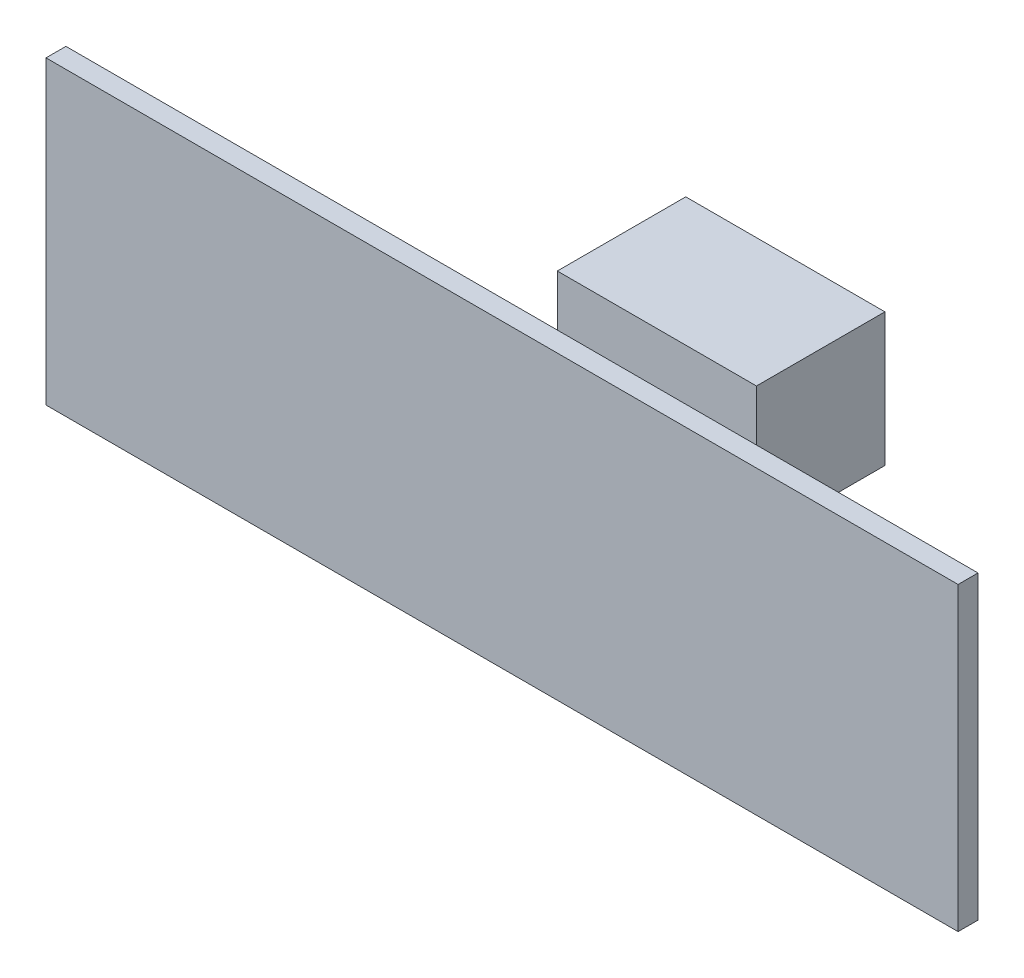
ISO-10303-21;
HEADER;
FILE_DESCRIPTION(('STEP AP214'),'2;1');
FILE_NAME('part.step','',(''),(''),'','','');
FILE_SCHEMA(('AUTOMOTIVE_DESIGN { 1 0 10303 214 1 1 1 1 }'));
ENDSEC;
DATA;
#1=APPLICATION_CONTEXT('core data for automotive mechanical design processes');
#2=APPLICATION_PROTOCOL_DEFINITION('international standard','automotive_design',2000,#1);
#3=PRODUCT_CONTEXT('',#1,'mechanical');
#4=PRODUCT('Part','Part','',(#3));
#5=PRODUCT_RELATED_PRODUCT_CATEGORY('part','',(#4));
#6=PRODUCT_DEFINITION_FORMATION('','',#4);
#7=PRODUCT_DEFINITION_CONTEXT('part definition',#1,'design');
#8=PRODUCT_DEFINITION('design','',#6,#7);
#9=PRODUCT_DEFINITION_SHAPE('','',#8);
#10=(LENGTH_UNIT() NAMED_UNIT(*) SI_UNIT(.MILLI.,.METRE.));
#11=(NAMED_UNIT(*) PLANE_ANGLE_UNIT() SI_UNIT($,.RADIAN.));
#12=(NAMED_UNIT(*) SI_UNIT($,.STERADIAN.) SOLID_ANGLE_UNIT());
#13=UNCERTAINTY_MEASURE_WITH_UNIT(LENGTH_MEASURE(1.E-05),#10,'distance_accuracy_value','');
#14=(GEOMETRIC_REPRESENTATION_CONTEXT(3) GLOBAL_UNCERTAINTY_ASSIGNED_CONTEXT((#13)) GLOBAL_UNIT_ASSIGNED_CONTEXT((#10,
#11,#12)) REPRESENTATION_CONTEXT('',''));
#15=CARTESIAN_POINT('',(0.,0.,0.));
#16=DIRECTION('',(0.,0.,1.));
#17=DIRECTION('',(1.,0.,0.));
#18=AXIS2_PLACEMENT_3D('',#15,#16,#17);
#19=CARTESIAN_POINT('',(12.7,-8.49001154742446,-8.1909510539635));
#20=DIRECTION('',(0.,0.,1.));
#21=DIRECTION('',(1.,0.,0.));
#22=AXIS2_PLACEMENT_3D('',#19,#20,#21);
#23=PLANE('',#22);
#24=DIRECTION('',(0.,1.,0.));
#25=VECTOR('',#24,1.);
#26=CARTESIAN_POINT('',(-12.7,-8.49001154742446,-8.1909510539635));
#27=LINE('',#26,#25);
#28=CARTESIAN_POINT('',(-12.7,-8.49001154742446,-8.1909510539635));
#29=VERTEX_POINT('',#28);
#30=CARTESIAN_POINT('',(-12.7,8.49001154742446,-8.1909510539635));
#31=VERTEX_POINT('',#30);
#32=EDGE_CURVE('E106',#29,#31,#27,.T.);
#33=ORIENTED_EDGE('',*,*,#32,.T.);
#34=DIRECTION('',(-1.,0.,0.));
#35=VECTOR('',#34,1.);
#36=CARTESIAN_POINT('',(12.7,8.49001154742446,-8.1909510539635));
#37=LINE('',#36,#35);
#38=CARTESIAN_POINT('',(12.7,8.49001154742446,-8.1909510539635));
#39=VERTEX_POINT('',#38);
#40=EDGE_CURVE('E12',#39,#31,#37,.T.);
#41=ORIENTED_EDGE('',*,*,#40,.F.);
#42=DIRECTION('',(0.,1.,0.));
#43=VECTOR('',#42,1.);
#44=CARTESIAN_POINT('',(12.7,-8.49001154742446,-8.1909510539635));
#45=LINE('',#44,#43);
#46=CARTESIAN_POINT('',(12.7,-8.49001154742446,-8.1909510539635));
#47=VERTEX_POINT('',#46);
#48=EDGE_CURVE('E94',#47,#39,#45,.T.);
#49=ORIENTED_EDGE('',*,*,#48,.F.);
#50=DIRECTION('',(-1.,0.,0.));
#51=VECTOR('',#50,1.);
#52=CARTESIAN_POINT('',(12.7,-8.49001154742446,-8.1909510539635));
#53=LINE('',#52,#51);
#54=EDGE_CURVE('E102',#47,#29,#53,.T.);
#55=ORIENTED_EDGE('',*,*,#54,.T.);
#56=EDGE_LOOP('',(#33,#41,#49,#55));
#57=FACE_BOUND('',#56,.T.);
#58=ADVANCED_FACE('F43',(#57),#23,.F.);
#59=CARTESIAN_POINT('',(12.7,8.49001154742446,8.1909510539635));
#60=DIRECTION('',(0.,-1.,0.));
#61=DIRECTION('',(0.,0.,-1.));
#62=AXIS2_PLACEMENT_3D('',#59,#60,#61);
#63=PLANE('',#62);
#64=DIRECTION('',(0.,0.,1.));
#65=VECTOR('',#64,1.);
#66=CARTESIAN_POINT('',(-12.7,8.49001154742446,8.1909510539635));
#67=LINE('',#66,#65);
#68=CARTESIAN_POINT('',(-12.7,8.49001154742446,8.1909510539635));
#69=VERTEX_POINT('',#68);
#70=EDGE_CURVE('E98',#31,#69,#67,.T.);
#71=ORIENTED_EDGE('',*,*,#70,.T.);
#72=DIRECTION('',(-1.,0.,0.));
#73=VECTOR('',#72,1.);
#74=CARTESIAN_POINT('',(12.7,8.49001154742446,8.1909510539635));
#75=LINE('',#74,#73);
#76=CARTESIAN_POINT('',(12.7,8.49001154742446,8.1909510539635));
#77=VERTEX_POINT('',#76);
#78=EDGE_CURVE('E51',#77,#69,#75,.T.);
#79=ORIENTED_EDGE('',*,*,#78,.F.);
#80=DIRECTION('',(0.,0.,1.));
#81=VECTOR('',#80,1.);
#82=CARTESIAN_POINT('',(12.7,8.49001154742446,8.1909510539635));
#83=LINE('',#82,#81);
#84=EDGE_CURVE('E89',#39,#77,#83,.T.);
#85=ORIENTED_EDGE('',*,*,#84,.F.);
#86=ORIENTED_EDGE('',*,*,#40,.T.);
#87=EDGE_LOOP('',(#71,#79,#85,#86));
#88=FACE_BOUND('',#87,.T.);
#89=ADVANCED_FACE('F97',(#88),#63,.F.);
#90=CARTESIAN_POINT('',(12.7,-8.49001154742446,8.1909510539635));
#91=DIRECTION('',(0.,0.,-1.));
#92=DIRECTION('',(-1.,0.,0.));
#93=AXIS2_PLACEMENT_3D('',#90,#91,#92);
#94=PLANE('',#93);
#95=DIRECTION('',(0.,-1.,0.));
#96=VECTOR('',#95,1.);
#97=CARTESIAN_POINT('',(-12.7,-8.49001154742446,8.1909510539635));
#98=LINE('',#97,#96);
#99=CARTESIAN_POINT('',(-12.7,-8.49001154742446,8.1909510539635));
#100=VERTEX_POINT('',#99);
#101=EDGE_CURVE('E76',#69,#100,#98,.T.);
#102=ORIENTED_EDGE('',*,*,#101,.T.);
#103=DIRECTION('',(-1.,0.,0.));
#104=VECTOR('',#103,1.);
#105=CARTESIAN_POINT('',(12.7,-8.49001154742446,8.1909510539635));
#106=LINE('',#105,#104);
#107=CARTESIAN_POINT('',(12.7,-8.49001154742446,8.1909510539635));
#108=VERTEX_POINT('',#107);
#109=EDGE_CURVE('E99',#108,#100,#106,.T.);
#110=ORIENTED_EDGE('',*,*,#109,.F.);
#111=DIRECTION('',(0.,-1.,0.));
#112=VECTOR('',#111,1.);
#113=CARTESIAN_POINT('',(12.7,-8.49001154742446,8.1909510539635));
#114=LINE('',#113,#112);
#115=EDGE_CURVE('E92',#77,#108,#114,.T.);
#116=ORIENTED_EDGE('',*,*,#115,.F.);
#117=ORIENTED_EDGE('',*,*,#78,.T.);
#118=EDGE_LOOP('',(#102,#110,#116,#117));
#119=FACE_BOUND('',#118,.T.);
#120=ADVANCED_FACE('F100',(#119),#94,.F.);
#121=CARTESIAN_POINT('',(12.7,-8.49001154742446,8.1909510539635));
#122=DIRECTION('',(0.,1.,0.));
#123=DIRECTION('',(0.,0.,1.));
#124=AXIS2_PLACEMENT_3D('',#121,#122,#123);
#125=PLANE('',#124);
#126=DIRECTION('',(0.,0.,-1.));
#127=VECTOR('',#126,1.);
#128=CARTESIAN_POINT('',(-12.7,-8.49001154742446,8.1909510539635));
#129=LINE('',#128,#127);
#130=EDGE_CURVE('E82',#100,#29,#129,.T.);
#131=ORIENTED_EDGE('',*,*,#130,.T.);
#132=ORIENTED_EDGE('',*,*,#54,.F.);
#133=DIRECTION('',(0.,0.,-1.));
#134=VECTOR('',#133,1.);
#135=CARTESIAN_POINT('',(12.7,-8.49001154742446,8.1909510539635));
#136=LINE('',#135,#134);
#137=EDGE_CURVE('E59',#108,#47,#136,.T.);
#138=ORIENTED_EDGE('',*,*,#137,.F.);
#139=ORIENTED_EDGE('',*,*,#109,.T.);
#140=EDGE_LOOP('',(#131,#132,#138,#139));
#141=FACE_BOUND('',#140,.T.);
#142=ADVANCED_FACE('F113',(#141),#125,.F.);
#143=CARTESIAN_POINT('',(12.7,0.,0.));
#144=DIRECTION('',(-1.,0.,0.));
#145=DIRECTION('',(0.,0.,1.));
#146=AXIS2_PLACEMENT_3D('',#143,#144,#145);
#147=PLANE('',#146);
#148=ORIENTED_EDGE('',*,*,#48,.T.);
#149=ORIENTED_EDGE('',*,*,#84,.T.);
#150=ORIENTED_EDGE('',*,*,#115,.T.);
#151=ORIENTED_EDGE('',*,*,#137,.T.);
#152=EDGE_LOOP('',(#148,#149,#150,#151));
#153=FACE_BOUND('',#152,.T.);
#154=ADVANCED_FACE('F90',(#153),#147,.F.);
#155=CARTESIAN_POINT('',(-12.7,0.,0.));
#156=DIRECTION('',(-1.,0.,0.));
#157=DIRECTION('',(0.,0.,1.));
#158=AXIS2_PLACEMENT_3D('',#155,#156,#157);
#159=PLANE('',#158);
#160=ORIENTED_EDGE('',*,*,#32,.F.);
#161=ORIENTED_EDGE('',*,*,#130,.F.);
#162=ORIENTED_EDGE('',*,*,#101,.F.);
#163=ORIENTED_EDGE('',*,*,#70,.F.);
#164=EDGE_LOOP('',(#160,#161,#162,#163));
#165=FACE_BOUND('',#164,.T.);
#166=ADVANCED_FACE('F116',(#165),#159,.T.);
#167=CLOSED_SHELL('',(#58,#89,#120,#142,#154,#166));
#168=MANIFOLD_SOLID_BREP('B2',#167);
#169=CARTESIAN_POINT('',(58.1633971714695,-19.1746549889515,27.94));
#170=DIRECTION('',(-1.,0.,0.));
#171=DIRECTION('',(0.,0.,1.));
#172=AXIS2_PLACEMENT_3D('',#169,#170,#171);
#173=PLANE('',#172);
#174=DIRECTION('',(0.,1.,0.));
#175=VECTOR('',#174,1.);
#176=CARTESIAN_POINT('',(58.1633971714695,-19.1746549889515,25.4));
#177=LINE('',#176,#175);
#178=CARTESIAN_POINT('',(58.1633971714695,-19.1746549889515,25.4));
#179=VERTEX_POINT('',#178);
#180=CARTESIAN_POINT('',(58.1633971714695,19.1746549889515,25.4));
#181=VERTEX_POINT('',#180);
#182=EDGE_CURVE('E230',#179,#181,#177,.T.);
#183=ORIENTED_EDGE('',*,*,#182,.T.);
#184=DIRECTION('',(0.,0.,-1.));
#185=VECTOR('',#184,1.);
#186=CARTESIAN_POINT('',(58.1633971714695,19.1746549889515,27.94));
#187=LINE('',#186,#185);
#188=CARTESIAN_POINT('',(58.1633971714695,19.1746549889515,27.94));
#189=VERTEX_POINT('',#188);
#190=EDGE_CURVE('E41',#189,#181,#187,.T.);
#191=ORIENTED_EDGE('',*,*,#190,.F.);
#192=DIRECTION('',(0.,1.,0.));
#193=VECTOR('',#192,1.);
#194=CARTESIAN_POINT('',(58.1633971714695,-19.1746549889515,27.94));
#195=LINE('',#194,#193);
#196=CARTESIAN_POINT('',(58.1633971714695,-19.1746549889515,27.94));
#197=VERTEX_POINT('',#196);
#198=EDGE_CURVE('E218',#197,#189,#195,.T.);
#199=ORIENTED_EDGE('',*,*,#198,.F.);
#200=DIRECTION('',(0.,0.,-1.));
#201=VECTOR('',#200,1.);
#202=CARTESIAN_POINT('',(58.1633971714695,-19.1746549889515,27.94));
#203=LINE('',#202,#201);
#204=EDGE_CURVE('E226',#197,#179,#203,.T.);
#205=ORIENTED_EDGE('',*,*,#204,.T.);
#206=EDGE_LOOP('',(#183,#191,#199,#205));
#207=FACE_BOUND('',#206,.T.);
#208=ADVANCED_FACE('F167',(#207),#173,.F.);
#209=CARTESIAN_POINT('',(-58.1633971714695,19.1746549889515,27.94));
#210=DIRECTION('',(0.,-1.,0.));
#211=DIRECTION('',(0.,0.,-1.));
#212=AXIS2_PLACEMENT_3D('',#209,#210,#211);
#213=PLANE('',#212);
#214=DIRECTION('',(-1.,0.,0.));
#215=VECTOR('',#214,1.);
#216=CARTESIAN_POINT('',(-58.1633971714695,19.1746549889515,25.4));
#217=LINE('',#216,#215);
#218=CARTESIAN_POINT('',(-58.1633971714695,19.1746549889515,25.4));
#219=VERTEX_POINT('',#218);
#220=EDGE_CURVE('E222',#181,#219,#217,.T.);
#221=ORIENTED_EDGE('',*,*,#220,.T.);
#222=DIRECTION('',(0.,0.,-1.));
#223=VECTOR('',#222,1.);
#224=CARTESIAN_POINT('',(-58.1633971714695,19.1746549889515,27.94));
#225=LINE('',#224,#223);
#226=CARTESIAN_POINT('',(-58.1633971714695,19.1746549889515,27.94));
#227=VERTEX_POINT('',#226);
#228=EDGE_CURVE('E175',#227,#219,#225,.T.);
#229=ORIENTED_EDGE('',*,*,#228,.F.);
#230=DIRECTION('',(-1.,0.,0.));
#231=VECTOR('',#230,1.);
#232=CARTESIAN_POINT('',(-58.1633971714695,19.1746549889515,27.94));
#233=LINE('',#232,#231);
#234=EDGE_CURVE('E213',#189,#227,#233,.T.);
#235=ORIENTED_EDGE('',*,*,#234,.F.);
#236=ORIENTED_EDGE('',*,*,#190,.T.);
#237=EDGE_LOOP('',(#221,#229,#235,#236));
#238=FACE_BOUND('',#237,.T.);
#239=ADVANCED_FACE('F221',(#238),#213,.F.);
#240=CARTESIAN_POINT('',(-58.1633971714695,-19.1746549889515,27.94));
#241=DIRECTION('',(1.,0.,0.));
#242=DIRECTION('',(0.,0.,-1.));
#243=AXIS2_PLACEMENT_3D('',#240,#241,#242);
#244=PLANE('',#243);
#245=DIRECTION('',(0.,-1.,0.));
#246=VECTOR('',#245,1.);
#247=CARTESIAN_POINT('',(-58.1633971714695,-19.1746549889515,25.4));
#248=LINE('',#247,#246);
#249=CARTESIAN_POINT('',(-58.1633971714695,-19.1746549889515,25.4));
#250=VERTEX_POINT('',#249);
#251=EDGE_CURVE('E200',#219,#250,#248,.T.);
#252=ORIENTED_EDGE('',*,*,#251,.T.);
#253=DIRECTION('',(0.,0.,-1.));
#254=VECTOR('',#253,1.);
#255=CARTESIAN_POINT('',(-58.1633971714695,-19.1746549889515,27.94));
#256=LINE('',#255,#254);
#257=CARTESIAN_POINT('',(-58.1633971714695,-19.1746549889515,27.94));
#258=VERTEX_POINT('',#257);
#259=EDGE_CURVE('E223',#258,#250,#256,.T.);
#260=ORIENTED_EDGE('',*,*,#259,.F.);
#261=DIRECTION('',(0.,-1.,0.));
#262=VECTOR('',#261,1.);
#263=CARTESIAN_POINT('',(-58.1633971714695,-19.1746549889515,27.94));
#264=LINE('',#263,#262);
#265=EDGE_CURVE('E216',#227,#258,#264,.T.);
#266=ORIENTED_EDGE('',*,*,#265,.F.);
#267=ORIENTED_EDGE('',*,*,#228,.T.);
#268=EDGE_LOOP('',(#252,#260,#266,#267));
#269=FACE_BOUND('',#268,.T.);
#270=ADVANCED_FACE('F224',(#269),#244,.F.);
#271=CARTESIAN_POINT('',(-58.1633971714695,-19.1746549889515,27.94));
#272=DIRECTION('',(0.,1.,0.));
#273=DIRECTION('',(0.,0.,1.));
#274=AXIS2_PLACEMENT_3D('',#271,#272,#273);
#275=PLANE('',#274);
#276=DIRECTION('',(1.,0.,0.));
#277=VECTOR('',#276,1.);
#278=CARTESIAN_POINT('',(-58.1633971714695,-19.1746549889515,25.4));
#279=LINE('',#278,#277);
#280=EDGE_CURVE('E206',#250,#179,#279,.T.);
#281=ORIENTED_EDGE('',*,*,#280,.T.);
#282=ORIENTED_EDGE('',*,*,#204,.F.);
#283=DIRECTION('',(1.,0.,0.));
#284=VECTOR('',#283,1.);
#285=CARTESIAN_POINT('',(-58.1633971714695,-19.1746549889515,27.94));
#286=LINE('',#285,#284);
#287=EDGE_CURVE('E183',#258,#197,#286,.T.);
#288=ORIENTED_EDGE('',*,*,#287,.F.);
#289=ORIENTED_EDGE('',*,*,#259,.T.);
#290=EDGE_LOOP('',(#281,#282,#288,#289));
#291=FACE_BOUND('',#290,.T.);
#292=ADVANCED_FACE('F237',(#291),#275,.F.);
#293=CARTESIAN_POINT('',(0.,0.,27.94));
#294=DIRECTION('',(0.,0.,-1.));
#295=DIRECTION('',(-1.,0.,0.));
#296=AXIS2_PLACEMENT_3D('',#293,#294,#295);
#297=PLANE('',#296);
#298=ORIENTED_EDGE('',*,*,#198,.T.);
#299=ORIENTED_EDGE('',*,*,#234,.T.);
#300=ORIENTED_EDGE('',*,*,#265,.T.);
#301=ORIENTED_EDGE('',*,*,#287,.T.);
#302=EDGE_LOOP('',(#298,#299,#300,#301));
#303=FACE_BOUND('',#302,.T.);
#304=ADVANCED_FACE('F214',(#303),#297,.F.);
#305=CARTESIAN_POINT('',(0.,0.,25.4));
#306=DIRECTION('',(0.,0.,-1.));
#307=DIRECTION('',(-1.,0.,0.));
#308=AXIS2_PLACEMENT_3D('',#305,#306,#307);
#309=PLANE('',#308);
#310=ORIENTED_EDGE('',*,*,#182,.F.);
#311=ORIENTED_EDGE('',*,*,#280,.F.);
#312=ORIENTED_EDGE('',*,*,#251,.F.);
#313=ORIENTED_EDGE('',*,*,#220,.F.);
#314=EDGE_LOOP('',(#310,#311,#312,#313));
#315=FACE_BOUND('',#314,.T.);
#316=ADVANCED_FACE('F240',(#315),#309,.T.);
#317=CLOSED_SHELL('',(#208,#239,#270,#292,#304,#316));
#318=MANIFOLD_SOLID_BREP('B6',#317);
#319=ADVANCED_BREP_SHAPE_REPRESENTATION('',(#18,#168,#318),#14);
#320=SHAPE_DEFINITION_REPRESENTATION(#9,#319);
ENDSEC;
END-ISO-10303-21;
